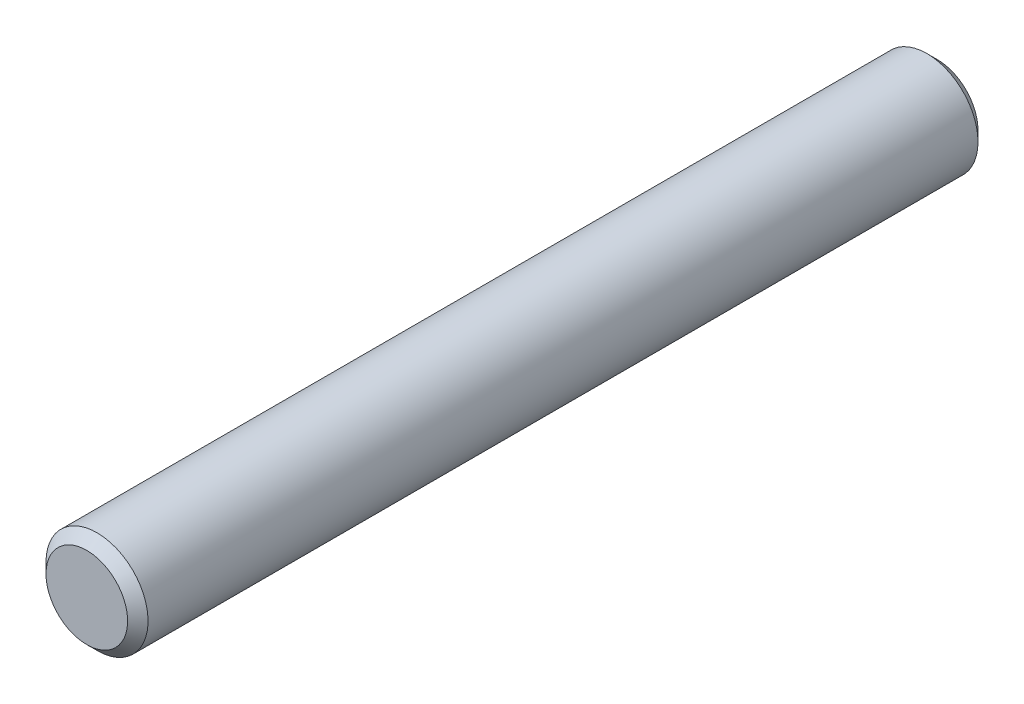
ISO-10303-21;
HEADER;
FILE_DESCRIPTION(('STEP AP214'),'2;1');
FILE_NAME('part.step','',(''),(''),'','','');
FILE_SCHEMA(('AUTOMOTIVE_DESIGN { 1 0 10303 214 1 1 1 1 }'));
ENDSEC;
DATA;
#1=APPLICATION_CONTEXT('core data for automotive mechanical design processes');
#2=APPLICATION_PROTOCOL_DEFINITION('international standard','automotive_design',2000,#1);
#3=PRODUCT_CONTEXT('',#1,'mechanical');
#4=PRODUCT('Part','Part','',(#3));
#5=PRODUCT_RELATED_PRODUCT_CATEGORY('part','',(#4));
#6=PRODUCT_DEFINITION_FORMATION('','',#4);
#7=PRODUCT_DEFINITION_CONTEXT('part definition',#1,'design');
#8=PRODUCT_DEFINITION('design','',#6,#7);
#9=PRODUCT_DEFINITION_SHAPE('','',#8);
#10=(LENGTH_UNIT() NAMED_UNIT(*) SI_UNIT(.MILLI.,.METRE.));
#11=(NAMED_UNIT(*) PLANE_ANGLE_UNIT() SI_UNIT($,.RADIAN.));
#12=(NAMED_UNIT(*) SI_UNIT($,.STERADIAN.) SOLID_ANGLE_UNIT());
#13=UNCERTAINTY_MEASURE_WITH_UNIT(LENGTH_MEASURE(1.E-05),#10,'distance_accuracy_value','');
#14=(GEOMETRIC_REPRESENTATION_CONTEXT(3) GLOBAL_UNCERTAINTY_ASSIGNED_CONTEXT((#13)) GLOBAL_UNIT_ASSIGNED_CONTEXT((#10,
#11,#12)) REPRESENTATION_CONTEXT('',''));
#15=CARTESIAN_POINT('',(0.,0.,0.));
#16=DIRECTION('',(0.,0.,1.));
#17=DIRECTION('',(1.,0.,0.));
#18=AXIS2_PLACEMENT_3D('',#15,#16,#17);
#19=CARTESIAN_POINT('',(0.,0.,39.6875));
#20=DIRECTION('',(0.,0.,-1.));
#21=DIRECTION('',(-1.,0.,0.));
#22=AXIS2_PLACEMENT_3D('',#19,#20,#21);
#23=CYLINDRICAL_SURFACE('',#22,4.7625);
#24=CARTESIAN_POINT('',(0.,0.,-38.7349999999999));
#25=DIRECTION('',(0.,0.,1.));
#26=DIRECTION('',(1.,0.,0.));
#27=AXIS2_PLACEMENT_3D('',#24,#25,#26);
#28=CIRCLE('',#27,4.7625);
#29=CARTESIAN_POINT('',(-4.7625,0.,-38.735));
#30=VERTEX_POINT('',#29);
#31=EDGE_CURVE('E50',#30,#30,#28,.T.);
#32=CARTESIAN_POINT('',(0.,0.,38.735));
#33=DIRECTION('',(0.,0.,1.));
#34=DIRECTION('',(1.,0.,0.));
#35=AXIS2_PLACEMENT_3D('',#32,#33,#34);
#36=CIRCLE('',#35,4.7625);
#37=CARTESIAN_POINT('',(-4.7625,0.,38.735));
#38=VERTEX_POINT('',#37);
#39=EDGE_CURVE('E55',#38,#38,#36,.F.);
#40=CARTESIAN_POINT('',(-4.7625,0.,-38.735));
#41=CARTESIAN_POINT('',(-4.7625,0.,-37.9280208333333));
#42=CARTESIAN_POINT('',(-4.7625,0.,-37.1210416666666));
#43=CARTESIAN_POINT('',(-4.7625,0.,-35.5070833333333));
#44=CARTESIAN_POINT('',(-4.7625,0.,-34.7001041666666));
#45=CARTESIAN_POINT('',(-4.7625,0.,-33.0861458333333));
#46=CARTESIAN_POINT('',(-4.7625,0.,-32.2791666666666));
#47=CARTESIAN_POINT('',(-4.7625,0.,-30.6652083333333));
#48=CARTESIAN_POINT('',(-4.7625,0.,-29.8582291666666));
#49=CARTESIAN_POINT('',(-4.7625,0.,-28.2442708333333));
#50=CARTESIAN_POINT('',(-4.7625,0.,-27.4372916666666));
#51=CARTESIAN_POINT('',(-4.7625,0.,-25.8233333333333));
#52=CARTESIAN_POINT('',(-4.7625,0.,-25.0163541666666));
#53=CARTESIAN_POINT('',(-4.7625,0.,-23.4023958333333));
#54=CARTESIAN_POINT('',(-4.7625,0.,-22.5954166666666));
#55=CARTESIAN_POINT('',(-4.7625,0.,-20.9814583333333));
#56=CARTESIAN_POINT('',(-4.7625,0.,-20.1744791666666));
#57=CARTESIAN_POINT('',(-4.7625,0.,-18.5605208333333));
#58=CARTESIAN_POINT('',(-4.7625,0.,-17.7535416666666));
#59=CARTESIAN_POINT('',(-4.7625,0.,-16.1395833333333));
#60=CARTESIAN_POINT('',(-4.7625,0.,-15.3326041666666));
#61=CARTESIAN_POINT('',(-4.7625,0.,-13.7186458333333));
#62=CARTESIAN_POINT('',(-4.7625,0.,-12.9116666666666));
#63=CARTESIAN_POINT('',(-4.7625,0.,-11.2977083333333));
#64=CARTESIAN_POINT('',(-4.7625,0.,-10.4907291666666));
#65=CARTESIAN_POINT('',(-4.7625,0.,-8.87677083333331));
#66=CARTESIAN_POINT('',(-4.7625,0.,-8.06979166666664));
#67=CARTESIAN_POINT('',(-4.7625,0.,-6.45583333333331));
#68=CARTESIAN_POINT('',(-4.7625,0.,-5.64885416666664));
#69=CARTESIAN_POINT('',(-4.7625,0.,-4.03489583333331));
#70=CARTESIAN_POINT('',(-4.7625,0.,-3.22791666666664));
#71=CARTESIAN_POINT('',(-4.7625,0.,-1.6139583333333));
#72=CARTESIAN_POINT('',(-4.7625,0.,-0.806979166666638));
#73=CARTESIAN_POINT('',(-4.7625,0.,0.806979166666694));
#74=CARTESIAN_POINT('',(-4.7625,0.,1.61395833333336));
#75=CARTESIAN_POINT('',(-4.7625,0.,3.22791666666669));
#76=CARTESIAN_POINT('',(-4.7625,0.,4.03489583333336));
#77=CARTESIAN_POINT('',(-4.7625,0.,5.6488541666667));
#78=CARTESIAN_POINT('',(-4.7625,0.,6.45583333333336));
#79=CARTESIAN_POINT('',(-4.7625,0.,8.06979166666669));
#80=CARTESIAN_POINT('',(-4.7625,0.,8.87677083333336));
#81=CARTESIAN_POINT('',(-4.7625,0.,10.4907291666667));
#82=CARTESIAN_POINT('',(-4.7625,0.,11.2977083333334));
#83=CARTESIAN_POINT('',(-4.7625,0.,12.9116666666667));
#84=CARTESIAN_POINT('',(-4.7625,0.,13.7186458333334));
#85=CARTESIAN_POINT('',(-4.7625,0.,15.3326041666667));
#86=CARTESIAN_POINT('',(-4.7625,0.,16.1395833333334));
#87=CARTESIAN_POINT('',(-4.7625,0.,17.7535416666667));
#88=CARTESIAN_POINT('',(-4.7625,0.,18.5605208333334));
#89=CARTESIAN_POINT('',(-4.7625,0.,20.1744791666667));
#90=CARTESIAN_POINT('',(-4.7625,0.,20.9814583333334));
#91=CARTESIAN_POINT('',(-4.7625,0.,22.5954166666667));
#92=CARTESIAN_POINT('',(-4.7625,0.,23.4023958333334));
#93=CARTESIAN_POINT('',(-4.7625,0.,25.0163541666667));
#94=CARTESIAN_POINT('',(-4.7625,0.,25.8233333333334));
#95=CARTESIAN_POINT('',(-4.7625,0.,27.4372916666667));
#96=CARTESIAN_POINT('',(-4.7625,0.,28.2442708333333));
#97=CARTESIAN_POINT('',(-4.7625,0.,29.8582291666667));
#98=CARTESIAN_POINT('',(-4.7625,0.,30.6652083333334));
#99=CARTESIAN_POINT('',(-4.7625,0.,32.2791666666667));
#100=CARTESIAN_POINT('',(-4.7625,0.,33.0861458333334));
#101=CARTESIAN_POINT('',(-4.7625,0.,34.7001041666667));
#102=CARTESIAN_POINT('',(-4.7625,0.,35.5070833333334));
#103=CARTESIAN_POINT('',(-4.7625,0.,37.1210416666667));
#104=CARTESIAN_POINT('',(-4.7625,0.,37.9280208333334));
#105=CARTESIAN_POINT('',(-4.7625,0.,38.735));
#106=B_SPLINE_CURVE_WITH_KNOTS('',3,(#40,#41,#42,#43,#44,#45,#46,#47,#48,#49,#50,#51,#52,#53,
#54,#55,#56,#57,#58,#59,#60,#61,#62,#63,#64,#65,#66,#67,#68,#69,#70,#71,#72,#73,#74,#75,#76,#77,
#78,#79,#80,#81,#82,#83,#84,#85,#86,#87,#88,#89,#90,#91,#92,#93,#94,#95,#96,#97,#98,#99,#100,
#101,#102,#103,#104,#105),.UNSPECIFIED.,.F.,.F.,(4,2,2,2,2,2,2,2,2,2,2,2,2,2,2,2,2,2,2,2,2,2,2,
2,2,2,2,2,2,2,2,2,4),(0.,2.4209375,4.841875,7.26281249999999,9.68375000000001,12.1046875,
14.525625,16.9465625,19.3675,21.7884375,24.209375,26.6303125,29.05125,31.4721875,33.893125,
36.3140625,38.735,41.1559375,43.576875,45.9978125,48.41875,50.8396875,53.260625,55.6815625,
58.1025,60.5234375,62.944375,65.3653125,67.78625,70.2071875,72.628125,75.0490625,77.47),.UNSPECIFIED.);
#107=EDGE_CURVE('BSEAM37',#30,#38,#106,.T.);
#108=ORIENTED_EDGE('',*,*,#31,.T.);
#109=ORIENTED_EDGE('',*,*,#39,.T.);
#110=ORIENTED_EDGE('',*,*,#107,.T.);
#111=ORIENTED_EDGE('',*,*,#107,.F.);
#112=EDGE_LOOP('',(#108,#110,#109,#111));
#113=FACE_BOUND('',#112,.T.);
#114=ADVANCED_FACE('F37',(#113),#23,.T.);
#115=CARTESIAN_POINT('',(0.,0.,39.6875));
#116=DIRECTION('',(0.,0.,1.));
#117=DIRECTION('',(1.,0.,0.));
#118=AXIS2_PLACEMENT_3D('',#115,#116,#117);
#119=PLANE('',#118);
#120=CARTESIAN_POINT('',(0.,0.,39.6875));
#121=DIRECTION('',(0.,0.,1.));
#122=DIRECTION('',(1.,0.,0.));
#123=AXIS2_PLACEMENT_3D('',#120,#121,#122);
#124=CIRCLE('',#123,3.81000000000002);
#125=CARTESIAN_POINT('',(-3.81000000000002,0.,39.6875));
#126=VERTEX_POINT('',#125);
#127=EDGE_CURVE('E10',#126,#126,#124,.T.);
#128=ORIENTED_EDGE('',*,*,#127,.T.);
#129=EDGE_LOOP('',(#128));
#130=FACE_BOUND('',#129,.T.);
#131=ADVANCED_FACE('F72',(#130),#119,.T.);
#132=CARTESIAN_POINT('',(0.,0.,-39.6875));
#133=DIRECTION('',(0.,0.,1.));
#134=DIRECTION('',(1.,0.,0.));
#135=AXIS2_PLACEMENT_3D('',#132,#133,#134);
#136=PLANE('',#135);
#137=CARTESIAN_POINT('',(0.,0.,-39.6875));
#138=DIRECTION('',(0.,0.,1.));
#139=DIRECTION('',(1.,0.,0.));
#140=AXIS2_PLACEMENT_3D('',#137,#138,#139);
#141=CIRCLE('',#140,3.80999999999995);
#142=CARTESIAN_POINT('',(3.80999999999995,0.,-39.6875));
#143=VERTEX_POINT('',#142);
#144=EDGE_CURVE('E45',#143,#143,#141,.F.);
#145=ORIENTED_EDGE('',*,*,#144,.T.);
#146=EDGE_LOOP('',(#145));
#147=FACE_BOUND('',#146,.T.);
#148=ADVANCED_FACE('F69',(#147),#136,.F.);
#149=CARTESIAN_POINT('',(0.,0.,-38.7349999999999));
#150=DIRECTION('',(0.,0.,1.));
#151=DIRECTION('',(1.,0.,0.));
#152=AXIS2_PLACEMENT_3D('',#149,#150,#151);
#153=CONICAL_SURFACE('',#152,4.7625,0.785398163397447);
#154=ORIENTED_EDGE('',*,*,#144,.F.);
#155=EDGE_LOOP('',(#154));
#156=FACE_BOUND('',#155,.T.);
#157=ORIENTED_EDGE('',*,*,#31,.F.);
#158=EDGE_LOOP('',(#157));
#159=FACE_BOUND('',#158,.T.);
#160=ADVANCED_FACE('F65',(#156,#159),#153,.T.);
#161=CARTESIAN_POINT('',(0.,0.,39.6875));
#162=DIRECTION('',(0.,0.,-1.));
#163=DIRECTION('',(-1.,0.,0.));
#164=AXIS2_PLACEMENT_3D('',#161,#162,#163);
#165=CONICAL_SURFACE('',#164,3.81000000000002,0.785398163397447);
#166=CARTESIAN_POINT('',(-4.7625,0.,38.735));
#167=CARTESIAN_POINT('',(-4.752578125,0.,38.744921875));
#168=CARTESIAN_POINT('',(-4.74265625,0.,38.75484375));
#169=CARTESIAN_POINT('',(-4.72281250000001,0.,38.7746875));
#170=CARTESIAN_POINT('',(-4.712890625,0.,38.784609375));
#171=CARTESIAN_POINT('',(-4.693046875,0.,38.804453125));
#172=CARTESIAN_POINT('',(-4.683125,0.,38.814375));
#173=CARTESIAN_POINT('',(-4.66328125000001,0.,38.83421875));
#174=CARTESIAN_POINT('',(-4.65335937500001,0.,38.844140625));
#175=CARTESIAN_POINT('',(-4.63351562500001,0.,38.863984375));
#176=CARTESIAN_POINT('',(-4.62359375000001,0.,38.87390625));
#177=CARTESIAN_POINT('',(-4.60375000000001,0.,38.89375));
#178=CARTESIAN_POINT('',(-4.59382812500001,0.,38.903671875));
#179=CARTESIAN_POINT('',(-4.57398437500001,0.,38.923515625));
#180=CARTESIAN_POINT('',(-4.56406250000001,0.,38.9334375));
#181=CARTESIAN_POINT('',(-4.54421875000001,0.,38.95328125));
#182=CARTESIAN_POINT('',(-4.53429687500001,0.,38.963203125));
#183=CARTESIAN_POINT('',(-4.51445312500001,0.,38.983046875));
#184=CARTESIAN_POINT('',(-4.50453125000001,0.,38.99296875));
#185=CARTESIAN_POINT('',(-4.48468750000001,0.,39.0128125));
#186=CARTESIAN_POINT('',(-4.47476562500001,0.,39.022734375));
#187=CARTESIAN_POINT('',(-4.45492187500001,0.,39.042578125));
#188=CARTESIAN_POINT('',(-4.44500000000001,0.,39.0525));
#189=CARTESIAN_POINT('',(-4.42515625000001,0.,39.07234375));
#190=CARTESIAN_POINT('',(-4.41523437500001,0.,39.082265625));
#191=CARTESIAN_POINT('',(-4.39539062500001,0.,39.102109375));
#192=CARTESIAN_POINT('',(-4.38546875000001,0.,39.11203125));
#193=CARTESIAN_POINT('',(-4.36562500000001,0.,39.131875));
#194=CARTESIAN_POINT('',(-4.35570312500001,0.,39.141796875));
#195=CARTESIAN_POINT('',(-4.33585937500001,0.,39.161640625));
#196=CARTESIAN_POINT('',(-4.32593750000001,0.,39.1715625));
#197=CARTESIAN_POINT('',(-4.30609375000001,0.,39.19140625));
#198=CARTESIAN_POINT('',(-4.29617187500001,0.,39.201328125));
#199=CARTESIAN_POINT('',(-4.27632812500001,0.,39.221171875));
#200=CARTESIAN_POINT('',(-4.26640625000001,0.,39.23109375));
#201=CARTESIAN_POINT('',(-4.24656250000001,0.,39.2509375));
#202=CARTESIAN_POINT('',(-4.23664062500001,0.,39.260859375));
#203=CARTESIAN_POINT('',(-4.21679687500002,0.,39.280703125));
#204=CARTESIAN_POINT('',(-4.20687500000001,0.,39.290625));
#205=CARTESIAN_POINT('',(-4.18703125000002,0.,39.31046875));
#206=CARTESIAN_POINT('',(-4.17710937500002,0.,39.320390625));
#207=CARTESIAN_POINT('',(-4.15726562500002,0.,39.340234375));
#208=CARTESIAN_POINT('',(-4.14734375000002,0.,39.35015625));
#209=CARTESIAN_POINT('',(-4.12750000000002,0.,39.37));
#210=CARTESIAN_POINT('',(-4.11757812500002,0.,39.379921875));
#211=CARTESIAN_POINT('',(-4.09773437500002,0.,39.399765625));
#212=CARTESIAN_POINT('',(-4.08781250000002,0.,39.4096875));
#213=CARTESIAN_POINT('',(-4.06796875000002,0.,39.42953125));
#214=CARTESIAN_POINT('',(-4.05804687500002,0.,39.439453125));
#215=CARTESIAN_POINT('',(-4.03820312500002,0.,39.459296875));
#216=CARTESIAN_POINT('',(-4.02828125000002,0.,39.46921875));
#217=CARTESIAN_POINT('',(-4.00843750000002,0.,39.4890625));
#218=CARTESIAN_POINT('',(-3.99851562500002,0.,39.498984375));
#219=CARTESIAN_POINT('',(-3.97867187500002,0.,39.518828125));
#220=CARTESIAN_POINT('',(-3.96875000000002,0.,39.52875));
#221=CARTESIAN_POINT('',(-3.94890625000002,0.,39.54859375));
#222=CARTESIAN_POINT('',(-3.93898437500002,0.,39.558515625));
#223=CARTESIAN_POINT('',(-3.91914062500002,0.,39.578359375));
#224=CARTESIAN_POINT('',(-3.90921875000002,0.,39.58828125));
#225=CARTESIAN_POINT('',(-3.88937500000002,0.,39.608125));
#226=CARTESIAN_POINT('',(-3.87945312500002,0.,39.618046875));
#227=CARTESIAN_POINT('',(-3.85960937500002,0.,39.637890625));
#228=CARTESIAN_POINT('',(-3.84968750000002,0.,39.6478125));
#229=CARTESIAN_POINT('',(-3.82984375000002,0.,39.66765625));
#230=CARTESIAN_POINT('',(-3.81992187500002,0.,39.677578125));
#231=CARTESIAN_POINT('',(-3.81000000000002,0.,39.6875));
#232=B_SPLINE_CURVE_WITH_KNOTS('',3,(#166,#167,#168,#169,#170,#171,#172,#173,#174,#175,#176,
#177,#178,#179,#180,#181,#182,#183,#184,#185,#186,#187,#188,#189,#190,#191,#192,#193,#194,#195,
#196,#197,#198,#199,#200,#201,#202,#203,#204,#205,#206,#207,#208,#209,#210,#211,#212,#213,#214,
#215,#216,#217,#218,#219,#220,#221,#222,#223,#224,#225,#226,#227,#228,#229,#230,#231),
.UNSPECIFIED.,.F.,.F.,(4,2,2,2,2,2,2,2,2,2,2,2,2,2,2,2,2,2,2,2,2,2,2,2,2,2,2,2,2,2,2,2,4),(0.,
0.0420949505675139,0.0841899011350229,0.126284851702532,0.168379802270046,0.210474752837556,
0.252569703405065,0.294664653972579,0.336759604540088,0.378854555107597,0.420949505675112,
0.463044456242621,0.505139406810131,0.547234357377644,0.589329307945154,0.631424258512663,
0.673519209080172,0.715614159647686,0.757709110215195,0.799804060782705,0.841899011350219,
0.883993961917728,0.926088912485237,0.968183863052751,1.01027881362026,1.05237376418777,
1.09446871475528,1.13656366532279,1.1786586158903,1.22075356645782,1.26284851702533,
1.30494346759284,1.34703841816035),.UNSPECIFIED.);
#233=EDGE_CURVE('BSEAM39',#38,#126,#232,.T.);
#234=ORIENTED_EDGE('',*,*,#39,.F.);
#235=ORIENTED_EDGE('',*,*,#127,.F.);
#236=ORIENTED_EDGE('',*,*,#233,.T.);
#237=ORIENTED_EDGE('',*,*,#233,.F.);
#238=EDGE_LOOP('',(#234,#236,#235,#237));
#239=FACE_BOUND('',#238,.T.);
#240=ADVANCED_FACE('F39',(#239),#165,.T.);
#241=CLOSED_SHELL('',(#114,#131,#148,#160,#240));
#242=MANIFOLD_SOLID_BREP('B2',#241);
#243=ADVANCED_BREP_SHAPE_REPRESENTATION('',(#18,#242),#14);
#244=SHAPE_DEFINITION_REPRESENTATION(#9,#243);
ENDSEC;
END-ISO-10303-21;
